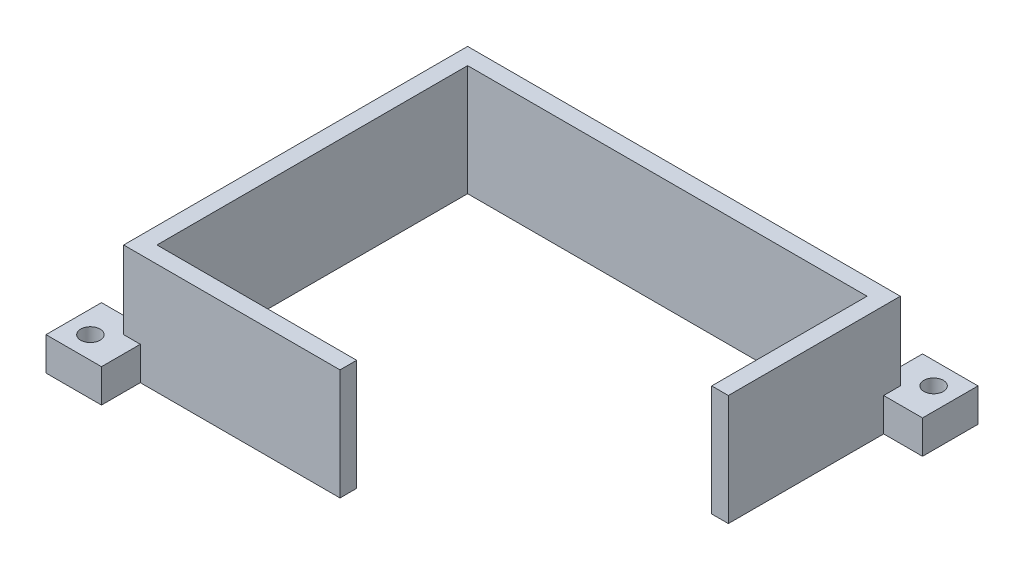
ISO-10303-21;
HEADER;
FILE_DESCRIPTION(('STEP AP214'),'2;1');
FILE_NAME('part.step','',(''),(''),'','','');
FILE_SCHEMA(('AUTOMOTIVE_DESIGN { 1 0 10303 214 1 1 1 1 }'));
ENDSEC;
DATA;
#1=APPLICATION_CONTEXT('core data for automotive mechanical design processes');
#2=APPLICATION_PROTOCOL_DEFINITION('international standard','automotive_design',2000,#1);
#3=PRODUCT_CONTEXT('',#1,'mechanical');
#4=PRODUCT('Part','Part','',(#3));
#5=PRODUCT_RELATED_PRODUCT_CATEGORY('part','',(#4));
#6=PRODUCT_DEFINITION_FORMATION('','',#4);
#7=PRODUCT_DEFINITION_CONTEXT('part definition',#1,'design');
#8=PRODUCT_DEFINITION('design','',#6,#7);
#9=PRODUCT_DEFINITION_SHAPE('','',#8);
#10=(LENGTH_UNIT() NAMED_UNIT(*) SI_UNIT(.MILLI.,.METRE.));
#11=(NAMED_UNIT(*) PLANE_ANGLE_UNIT() SI_UNIT($,.RADIAN.));
#12=(NAMED_UNIT(*) SI_UNIT($,.STERADIAN.) SOLID_ANGLE_UNIT());
#13=UNCERTAINTY_MEASURE_WITH_UNIT(LENGTH_MEASURE(1.E-05),#10,'distance_accuracy_value','');
#14=(GEOMETRIC_REPRESENTATION_CONTEXT(3) GLOBAL_UNCERTAINTY_ASSIGNED_CONTEXT((#13)) GLOBAL_UNIT_ASSIGNED_CONTEXT((#10,
#11,#12)) REPRESENTATION_CONTEXT('',''));
#15=CARTESIAN_POINT('',(0.,0.,0.));
#16=DIRECTION('',(0.,0.,1.));
#17=DIRECTION('',(1.,0.,0.));
#18=AXIS2_PLACEMENT_3D('',#15,#16,#17);
#19=CARTESIAN_POINT('',(-36.,20.,-28.));
#20=DIRECTION('',(-1.,0.,0.));
#21=DIRECTION('',(0.,0.,1.));
#22=AXIS2_PLACEMENT_3D('',#19,#20,#21);
#23=PLANE('',#22);
#24=DIRECTION('',(0.,0.,-1.));
#25=VECTOR('',#24,1.);
#26=CARTESIAN_POINT('',(-36.,0.,-28.));
#27=LINE('',#26,#25);
#28=CARTESIAN_POINT('',(-36.,0.,28.));
#29=VERTEX_POINT('',#28);
#30=CARTESIAN_POINT('',(-36.,0.,-28.));
#31=VERTEX_POINT('',#30);
#32=EDGE_CURVE('E334',#29,#31,#27,.T.);
#33=ORIENTED_EDGE('',*,*,#32,.T.);
#34=DIRECTION('',(0.,-1.,0.));
#35=VECTOR('',#34,1.);
#36=CARTESIAN_POINT('',(-36.,20.,-28.));
#37=LINE('',#36,#35);
#38=CARTESIAN_POINT('',(-36.,20.,-28.));
#39=VERTEX_POINT('',#38);
#40=EDGE_CURVE('E402',#39,#31,#37,.T.);
#41=ORIENTED_EDGE('',*,*,#40,.F.);
#42=DIRECTION('',(0.,0.,-1.));
#43=VECTOR('',#42,1.);
#44=CARTESIAN_POINT('',(-36.,20.,-28.));
#45=LINE('',#44,#43);
#46=CARTESIAN_POINT('',(-36.,20.,28.));
#47=VERTEX_POINT('',#46);
#48=EDGE_CURVE('E335',#47,#39,#45,.T.);
#49=ORIENTED_EDGE('',*,*,#48,.F.);
#50=DIRECTION('',(0.,-1.,0.));
#51=VECTOR('',#50,1.);
#52=CARTESIAN_POINT('',(-36.,20.,28.));
#53=LINE('',#52,#51);
#54=EDGE_CURVE('E357',#47,#29,#53,.T.);
#55=ORIENTED_EDGE('',*,*,#54,.T.);
#56=EDGE_LOOP('',(#33,#41,#49,#55));
#57=FACE_BOUND('',#56,.T.);
#58=ADVANCED_FACE('F35',(#57),#23,.F.);
#59=CARTESIAN_POINT('',(-36.,20.,-28.));
#60=DIRECTION('',(0.,0.,-1.));
#61=DIRECTION('',(-1.,0.,0.));
#62=AXIS2_PLACEMENT_3D('',#59,#60,#61);
#63=PLANE('',#62);
#64=DIRECTION('',(1.,0.,0.));
#65=VECTOR('',#64,1.);
#66=CARTESIAN_POINT('',(-36.,0.,-28.));
#67=LINE('',#66,#65);
#68=CARTESIAN_POINT('',(36.,0.,-28.));
#69=VERTEX_POINT('',#68);
#70=EDGE_CURVE('E360',#31,#69,#67,.T.);
#71=ORIENTED_EDGE('',*,*,#70,.T.);
#72=DIRECTION('',(0.,-1.,0.));
#73=VECTOR('',#72,1.);
#74=CARTESIAN_POINT('',(36.,20.,-28.));
#75=LINE('',#74,#73);
#76=CARTESIAN_POINT('',(36.,20.,-28.));
#77=VERTEX_POINT('',#76);
#78=EDGE_CURVE('E400',#77,#69,#75,.T.);
#79=ORIENTED_EDGE('',*,*,#78,.F.);
#80=DIRECTION('',(1.,0.,0.));
#81=VECTOR('',#80,1.);
#82=CARTESIAN_POINT('',(-36.,20.,-28.));
#83=LINE('',#82,#81);
#84=EDGE_CURVE('E338',#39,#77,#83,.T.);
#85=ORIENTED_EDGE('',*,*,#84,.F.);
#86=ORIENTED_EDGE('',*,*,#40,.T.);
#87=EDGE_LOOP('',(#71,#79,#85,#86));
#88=FACE_BOUND('',#87,.T.);
#89=ADVANCED_FACE('F472',(#88),#63,.F.);
#90=CARTESIAN_POINT('',(36.,20.,-28.));
#91=DIRECTION('',(1.,0.,0.));
#92=DIRECTION('',(0.,0.,-1.));
#93=AXIS2_PLACEMENT_3D('',#90,#91,#92);
#94=PLANE('',#93);
#95=DIRECTION('',(0.,0.,1.));
#96=VECTOR('',#95,1.);
#97=CARTESIAN_POINT('',(36.,0.,-28.));
#98=LINE('',#97,#96);
#99=CARTESIAN_POINT('',(36.,0.,0.));
#100=VERTEX_POINT('',#99);
#101=EDGE_CURVE('E363',#69,#100,#98,.T.);
#102=ORIENTED_EDGE('',*,*,#101,.T.);
#103=DIRECTION('',(0.,-1.,0.));
#104=VECTOR('',#103,1.);
#105=CARTESIAN_POINT('',(36.,20.,0.));
#106=LINE('',#105,#104);
#107=CARTESIAN_POINT('',(36.,20.,0.));
#108=VERTEX_POINT('',#107);
#109=EDGE_CURVE('E397',#108,#100,#106,.T.);
#110=ORIENTED_EDGE('',*,*,#109,.F.);
#111=DIRECTION('',(0.,0.,1.));
#112=VECTOR('',#111,1.);
#113=CARTESIAN_POINT('',(36.,20.,-28.));
#114=LINE('',#113,#112);
#115=EDGE_CURVE('E341',#77,#108,#114,.T.);
#116=ORIENTED_EDGE('',*,*,#115,.F.);
#117=ORIENTED_EDGE('',*,*,#78,.T.);
#118=EDGE_LOOP('',(#102,#110,#116,#117));
#119=FACE_BOUND('',#118,.T.);
#120=ADVANCED_FACE('F478',(#119),#94,.F.);
#121=CARTESIAN_POINT('',(39.,20.,0.));
#122=DIRECTION('',(0.,0.,-1.));
#123=DIRECTION('',(-1.,0.,0.));
#124=AXIS2_PLACEMENT_3D('',#121,#122,#123);
#125=PLANE('',#124);
#126=DIRECTION('',(1.,0.,0.));
#127=VECTOR('',#126,1.);
#128=CARTESIAN_POINT('',(39.,0.,0.));
#129=LINE('',#128,#127);
#130=CARTESIAN_POINT('',(39.,0.,0.));
#131=VERTEX_POINT('',#130);
#132=EDGE_CURVE('E365',#100,#131,#129,.T.);
#133=ORIENTED_EDGE('',*,*,#132,.T.);
#134=DIRECTION('',(0.,-1.,0.));
#135=VECTOR('',#134,1.);
#136=CARTESIAN_POINT('',(39.,20.,0.));
#137=LINE('',#136,#135);
#138=CARTESIAN_POINT('',(39.,20.,0.));
#139=VERTEX_POINT('',#138);
#140=EDGE_CURVE('E394',#139,#131,#137,.T.);
#141=ORIENTED_EDGE('',*,*,#140,.F.);
#142=DIRECTION('',(1.,0.,0.));
#143=VECTOR('',#142,1.);
#144=CARTESIAN_POINT('',(39.,20.,0.));
#145=LINE('',#144,#143);
#146=EDGE_CURVE('E343',#108,#139,#145,.T.);
#147=ORIENTED_EDGE('',*,*,#146,.F.);
#148=ORIENTED_EDGE('',*,*,#109,.T.);
#149=EDGE_LOOP('',(#133,#141,#147,#148));
#150=FACE_BOUND('',#149,.T.);
#151=ADVANCED_FACE('F535',(#150),#125,.F.);
#152=CARTESIAN_POINT('',(39.,20.,-31.));
#153=DIRECTION('',(-1.,0.,0.));
#154=DIRECTION('',(0.,0.,1.));
#155=AXIS2_PLACEMENT_3D('',#152,#153,#154);
#156=PLANE('',#155);
#157=DIRECTION('',(0.,0.,-1.));
#158=VECTOR('',#157,1.);
#159=CARTESIAN_POINT('',(39.,0.,-31.));
#160=LINE('',#159,#158);
#161=CARTESIAN_POINT('',(39.,0.,-28.));
#162=VERTEX_POINT('',#161);
#163=EDGE_CURVE('E367',#131,#162,#160,.T.);
#164=ORIENTED_EDGE('',*,*,#163,.T.);
#165=DIRECTION('',(0.,1.,0.));
#166=VECTOR('',#165,1.);
#167=CARTESIAN_POINT('',(39.,20.,-28.));
#168=LINE('',#167,#166);
#169=CARTESIAN_POINT('',(39.,6.,-28.));
#170=VERTEX_POINT('',#169);
#171=EDGE_CURVE('E49',#162,#170,#168,.T.);
#172=ORIENTED_EDGE('',*,*,#171,.T.);
#173=DIRECTION('',(0.,0.,1.));
#174=VECTOR('',#173,1.);
#175=CARTESIAN_POINT('',(39.,6.,-31.));
#176=LINE('',#175,#174);
#177=CARTESIAN_POINT('',(39.,6.,-31.));
#178=VERTEX_POINT('',#177);
#179=EDGE_CURVE('E246',#178,#170,#176,.T.);
#180=ORIENTED_EDGE('',*,*,#179,.F.);
#181=DIRECTION('',(0.,-1.,0.));
#182=VECTOR('',#181,1.);
#183=CARTESIAN_POINT('',(39.,20.,-31.));
#184=LINE('',#183,#182);
#185=CARTESIAN_POINT('',(39.,20.,-31.));
#186=VERTEX_POINT('',#185);
#187=EDGE_CURVE('E392',#186,#178,#184,.T.);
#188=ORIENTED_EDGE('',*,*,#187,.F.);
#189=DIRECTION('',(0.,0.,-1.));
#190=VECTOR('',#189,1.);
#191=CARTESIAN_POINT('',(39.,20.,-31.));
#192=LINE('',#191,#190);
#193=EDGE_CURVE('E345',#139,#186,#192,.T.);
#194=ORIENTED_EDGE('',*,*,#193,.F.);
#195=ORIENTED_EDGE('',*,*,#140,.T.);
#196=EDGE_LOOP('',(#164,#172,#180,#188,#194,#195));
#197=FACE_BOUND('',#196,.T.);
#198=ADVANCED_FACE('F532',(#197),#156,.F.);
#199=CARTESIAN_POINT('',(-39.,20.,-31.));
#200=DIRECTION('',(0.,0.,1.));
#201=DIRECTION('',(1.,0.,0.));
#202=AXIS2_PLACEMENT_3D('',#199,#200,#201);
#203=PLANE('',#202);
#204=DIRECTION('',(1.,0.,0.));
#205=VECTOR('',#204,1.);
#206=CARTESIAN_POINT('',(-39.,6.,-31.));
#207=LINE('',#206,#205);
#208=CARTESIAN_POINT('',(36.,6.,-31.));
#209=VERTEX_POINT('',#208);
#210=EDGE_CURVE('E11',#209,#178,#207,.T.);
#211=ORIENTED_EDGE('',*,*,#210,.F.);
#212=DIRECTION('',(0.,-1.,0.));
#213=VECTOR('',#212,1.);
#214=CARTESIAN_POINT('',(36.,20.,-31.));
#215=LINE('',#214,#213);
#216=CARTESIAN_POINT('',(36.,0.,-31.));
#217=VERTEX_POINT('',#216);
#218=EDGE_CURVE('E207',#209,#217,#215,.T.);
#219=ORIENTED_EDGE('',*,*,#218,.T.);
#220=DIRECTION('',(-1.,0.,0.));
#221=VECTOR('',#220,1.);
#222=CARTESIAN_POINT('',(-39.,0.,-31.));
#223=LINE('',#222,#221);
#224=CARTESIAN_POINT('',(-36.,0.,-31.));
#225=VERTEX_POINT('',#224);
#226=EDGE_CURVE('E369',#217,#225,#223,.T.);
#227=ORIENTED_EDGE('',*,*,#226,.T.);
#228=DIRECTION('',(0.,1.,0.));
#229=VECTOR('',#228,1.);
#230=CARTESIAN_POINT('',(-36.,20.,-31.));
#231=LINE('',#230,#229);
#232=CARTESIAN_POINT('',(-36.,6.,-31.));
#233=VERTEX_POINT('',#232);
#234=EDGE_CURVE('E279',#225,#233,#231,.T.);
#235=ORIENTED_EDGE('',*,*,#234,.T.);
#236=DIRECTION('',(1.,0.,0.));
#237=VECTOR('',#236,1.);
#238=CARTESIAN_POINT('',(-39.,6.,-31.));
#239=LINE('',#238,#237);
#240=CARTESIAN_POINT('',(-39.,6.,-31.));
#241=VERTEX_POINT('',#240);
#242=EDGE_CURVE('E288',#241,#233,#239,.T.);
#243=ORIENTED_EDGE('',*,*,#242,.F.);
#244=DIRECTION('',(0.,-1.,0.));
#245=VECTOR('',#244,1.);
#246=CARTESIAN_POINT('',(-39.,20.,-31.));
#247=LINE('',#246,#245);
#248=CARTESIAN_POINT('',(-39.,20.,-31.));
#249=VERTEX_POINT('',#248);
#250=EDGE_CURVE('E389',#249,#241,#247,.T.);
#251=ORIENTED_EDGE('',*,*,#250,.F.);
#252=DIRECTION('',(-1.,0.,0.));
#253=VECTOR('',#252,1.);
#254=CARTESIAN_POINT('',(-39.,20.,-31.));
#255=LINE('',#254,#253);
#256=EDGE_CURVE('E347',#186,#249,#255,.T.);
#257=ORIENTED_EDGE('',*,*,#256,.F.);
#258=ORIENTED_EDGE('',*,*,#187,.T.);
#259=EDGE_LOOP('',(#211,#219,#227,#235,#243,#251,#257,#258));
#260=FACE_BOUND('',#259,.T.);
#261=ADVANCED_FACE('F449',(#260),#203,.F.);
#262=CARTESIAN_POINT('',(-39.,20.,31.));
#263=DIRECTION('',(1.,0.,0.));
#264=DIRECTION('',(0.,0.,-1.));
#265=AXIS2_PLACEMENT_3D('',#262,#263,#264);
#266=PLANE('',#265);
#267=DIRECTION('',(0.,0.,-1.));
#268=VECTOR('',#267,1.);
#269=CARTESIAN_POINT('',(-39.,6.,31.));
#270=LINE('',#269,#268);
#271=CARTESIAN_POINT('',(-39.,6.,-28.));
#272=VERTEX_POINT('',#271);
#273=EDGE_CURVE('E42',#272,#241,#270,.T.);
#274=ORIENTED_EDGE('',*,*,#273,.F.);
#275=DIRECTION('',(0.,-1.,0.));
#276=VECTOR('',#275,1.);
#277=CARTESIAN_POINT('',(-39.,20.,-28.));
#278=LINE('',#277,#276);
#279=CARTESIAN_POINT('',(-39.,0.,-28.));
#280=VERTEX_POINT('',#279);
#281=EDGE_CURVE('E285',#272,#280,#278,.T.);
#282=ORIENTED_EDGE('',*,*,#281,.T.);
#283=DIRECTION('',(0.,0.,1.));
#284=VECTOR('',#283,1.);
#285=CARTESIAN_POINT('',(-39.,0.,31.));
#286=LINE('',#285,#284);
#287=CARTESIAN_POINT('',(-39.,0.,28.));
#288=VERTEX_POINT('',#287);
#289=EDGE_CURVE('E371',#280,#288,#286,.T.);
#290=ORIENTED_EDGE('',*,*,#289,.T.);
#291=DIRECTION('',(0.,1.,0.));
#292=VECTOR('',#291,1.);
#293=CARTESIAN_POINT('',(-39.,20.,28.));
#294=LINE('',#293,#292);
#295=CARTESIAN_POINT('',(-39.,6.,28.));
#296=VERTEX_POINT('',#295);
#297=EDGE_CURVE('E322',#288,#296,#294,.T.);
#298=ORIENTED_EDGE('',*,*,#297,.T.);
#299=DIRECTION('',(0.,0.,-1.));
#300=VECTOR('',#299,1.);
#301=CARTESIAN_POINT('',(-39.,6.,31.));
#302=LINE('',#301,#300);
#303=CARTESIAN_POINT('',(-39.,6.,31.));
#304=VERTEX_POINT('',#303);
#305=EDGE_CURVE('E331',#304,#296,#302,.T.);
#306=ORIENTED_EDGE('',*,*,#305,.F.);
#307=DIRECTION('',(0.,-1.,0.));
#308=VECTOR('',#307,1.);
#309=CARTESIAN_POINT('',(-39.,20.,31.));
#310=LINE('',#309,#308);
#311=CARTESIAN_POINT('',(-39.,20.,31.));
#312=VERTEX_POINT('',#311);
#313=EDGE_CURVE('E386',#312,#304,#310,.T.);
#314=ORIENTED_EDGE('',*,*,#313,.F.);
#315=DIRECTION('',(0.,0.,1.));
#316=VECTOR('',#315,1.);
#317=CARTESIAN_POINT('',(-39.,20.,31.));
#318=LINE('',#317,#316);
#319=EDGE_CURVE('E349',#249,#312,#318,.T.);
#320=ORIENTED_EDGE('',*,*,#319,.F.);
#321=ORIENTED_EDGE('',*,*,#250,.T.);
#322=EDGE_LOOP('',(#274,#282,#290,#298,#306,#314,#320,#321));
#323=FACE_BOUND('',#322,.T.);
#324=ADVANCED_FACE('F414',(#323),#266,.F.);
#325=CARTESIAN_POINT('',(0.,20.,31.));
#326=DIRECTION('',(0.,0.,-1.));
#327=DIRECTION('',(-1.,0.,0.));
#328=AXIS2_PLACEMENT_3D('',#325,#326,#327);
#329=PLANE('',#328);
#330=DIRECTION('',(-1.,0.,0.));
#331=VECTOR('',#330,1.);
#332=CARTESIAN_POINT('',(0.,6.,31.));
#333=LINE('',#332,#331);
#334=CARTESIAN_POINT('',(-36.,6.,31.));
#335=VERTEX_POINT('',#334);
#336=EDGE_CURVE('E404',#335,#304,#333,.T.);
#337=ORIENTED_EDGE('',*,*,#336,.F.);
#338=DIRECTION('',(0.,-1.,0.));
#339=VECTOR('',#338,1.);
#340=CARTESIAN_POINT('',(-36.,20.,31.));
#341=LINE('',#340,#339);
#342=CARTESIAN_POINT('',(-36.,0.,31.));
#343=VERTEX_POINT('',#342);
#344=EDGE_CURVE('E328',#335,#343,#341,.T.);
#345=ORIENTED_EDGE('',*,*,#344,.T.);
#346=DIRECTION('',(1.,0.,0.));
#347=VECTOR('',#346,1.);
#348=CARTESIAN_POINT('',(0.,0.,31.));
#349=LINE('',#348,#347);
#350=CARTESIAN_POINT('',(0.,0.,31.));
#351=VERTEX_POINT('',#350);
#352=EDGE_CURVE('E373',#343,#351,#349,.T.);
#353=ORIENTED_EDGE('',*,*,#352,.T.);
#354=DIRECTION('',(0.,-1.,0.));
#355=VECTOR('',#354,1.);
#356=CARTESIAN_POINT('',(0.,20.,31.));
#357=LINE('',#356,#355);
#358=CARTESIAN_POINT('',(0.,20.,31.));
#359=VERTEX_POINT('',#358);
#360=EDGE_CURVE('E383',#359,#351,#357,.T.);
#361=ORIENTED_EDGE('',*,*,#360,.F.);
#362=DIRECTION('',(1.,0.,0.));
#363=VECTOR('',#362,1.);
#364=CARTESIAN_POINT('',(0.,20.,31.));
#365=LINE('',#364,#363);
#366=EDGE_CURVE('E351',#312,#359,#365,.T.);
#367=ORIENTED_EDGE('',*,*,#366,.F.);
#368=ORIENTED_EDGE('',*,*,#313,.T.);
#369=EDGE_LOOP('',(#337,#345,#353,#361,#367,#368));
#370=FACE_BOUND('',#369,.T.);
#371=ADVANCED_FACE('F439',(#370),#329,.F.);
#372=CARTESIAN_POINT('',(0.,20.,28.));
#373=DIRECTION('',(-1.,0.,0.));
#374=DIRECTION('',(0.,0.,1.));
#375=AXIS2_PLACEMENT_3D('',#372,#373,#374);
#376=PLANE('',#375);
#377=DIRECTION('',(0.,0.,-1.));
#378=VECTOR('',#377,1.);
#379=CARTESIAN_POINT('',(0.,0.,28.));
#380=LINE('',#379,#378);
#381=CARTESIAN_POINT('',(0.,0.,28.));
#382=VERTEX_POINT('',#381);
#383=EDGE_CURVE('E375',#351,#382,#380,.T.);
#384=ORIENTED_EDGE('',*,*,#383,.T.);
#385=DIRECTION('',(0.,-1.,0.));
#386=VECTOR('',#385,1.);
#387=CARTESIAN_POINT('',(0.,20.,28.));
#388=LINE('',#387,#386);
#389=CARTESIAN_POINT('',(0.,20.,28.));
#390=VERTEX_POINT('',#389);
#391=EDGE_CURVE('E380',#390,#382,#388,.T.);
#392=ORIENTED_EDGE('',*,*,#391,.F.);
#393=DIRECTION('',(0.,0.,-1.));
#394=VECTOR('',#393,1.);
#395=CARTESIAN_POINT('',(0.,20.,28.));
#396=LINE('',#395,#394);
#397=EDGE_CURVE('E353',#359,#390,#396,.T.);
#398=ORIENTED_EDGE('',*,*,#397,.F.);
#399=ORIENTED_EDGE('',*,*,#360,.T.);
#400=EDGE_LOOP('',(#384,#392,#398,#399));
#401=FACE_BOUND('',#400,.T.);
#402=ADVANCED_FACE('F494',(#401),#376,.F.);
#403=CARTESIAN_POINT('',(-36.,20.,28.));
#404=DIRECTION('',(0.,0.,1.));
#405=DIRECTION('',(1.,0.,0.));
#406=AXIS2_PLACEMENT_3D('',#403,#404,#405);
#407=PLANE('',#406);
#408=DIRECTION('',(-1.,0.,0.));
#409=VECTOR('',#408,1.);
#410=CARTESIAN_POINT('',(-36.,0.,28.));
#411=LINE('',#410,#409);
#412=EDGE_CURVE('E339',#382,#29,#411,.T.);
#413=ORIENTED_EDGE('',*,*,#412,.T.);
#414=ORIENTED_EDGE('',*,*,#54,.F.);
#415=DIRECTION('',(-1.,0.,0.));
#416=VECTOR('',#415,1.);
#417=CARTESIAN_POINT('',(-36.,20.,28.));
#418=LINE('',#417,#416);
#419=EDGE_CURVE('E355',#390,#47,#418,.T.);
#420=ORIENTED_EDGE('',*,*,#419,.F.);
#421=ORIENTED_EDGE('',*,*,#391,.T.);
#422=EDGE_LOOP('',(#413,#414,#420,#421));
#423=FACE_BOUND('',#422,.T.);
#424=ADVANCED_FACE('F492',(#423),#407,.F.);
#425=CARTESIAN_POINT('',(0.,20.,0.));
#426=DIRECTION('',(0.,1.,0.));
#427=DIRECTION('',(0.,0.,1.));
#428=AXIS2_PLACEMENT_3D('',#425,#426,#427);
#429=PLANE('',#428);
#430=ORIENTED_EDGE('',*,*,#48,.T.);
#431=ORIENTED_EDGE('',*,*,#84,.T.);
#432=ORIENTED_EDGE('',*,*,#115,.T.);
#433=ORIENTED_EDGE('',*,*,#146,.T.);
#434=ORIENTED_EDGE('',*,*,#193,.T.);
#435=ORIENTED_EDGE('',*,*,#256,.T.);
#436=ORIENTED_EDGE('',*,*,#319,.T.);
#437=ORIENTED_EDGE('',*,*,#366,.T.);
#438=ORIENTED_EDGE('',*,*,#397,.T.);
#439=ORIENTED_EDGE('',*,*,#419,.T.);
#440=EDGE_LOOP('',(#430,#431,#432,#433,#434,#435,#436,#437,#438,#439));
#441=FACE_BOUND('',#440,.T.);
#442=ADVANCED_FACE('F444',(#441),#429,.T.);
#443=CARTESIAN_POINT('',(0.,0.,0.));
#444=DIRECTION('',(0.,1.,0.));
#445=DIRECTION('',(0.,0.,1.));
#446=AXIS2_PLACEMENT_3D('',#443,#444,#445);
#447=PLANE('',#446);
#448=ORIENTED_EDGE('',*,*,#101,.F.);
#449=ORIENTED_EDGE('',*,*,#70,.F.);
#450=ORIENTED_EDGE('',*,*,#32,.F.);
#451=ORIENTED_EDGE('',*,*,#412,.F.);
#452=ORIENTED_EDGE('',*,*,#383,.F.);
#453=ORIENTED_EDGE('',*,*,#352,.F.);
#454=DIRECTION('',(0.,0.,1.));
#455=VECTOR('',#454,1.);
#456=CARTESIAN_POINT('',(-36.,0.,28.));
#457=LINE('',#456,#455);
#458=CARTESIAN_POINT('',(-36.,0.,38.));
#459=VERTEX_POINT('',#458);
#460=EDGE_CURVE('E295',#343,#459,#457,.T.);
#461=ORIENTED_EDGE('',*,*,#460,.T.);
#462=DIRECTION('',(-1.,0.,0.));
#463=VECTOR('',#462,1.);
#464=CARTESIAN_POINT('',(-36.,0.,38.));
#465=LINE('',#464,#463);
#466=CARTESIAN_POINT('',(-46.,0.,38.));
#467=VERTEX_POINT('',#466);
#468=EDGE_CURVE('E312',#459,#467,#465,.T.);
#469=ORIENTED_EDGE('',*,*,#468,.T.);
#470=DIRECTION('',(0.,0.,-1.));
#471=VECTOR('',#470,1.);
#472=CARTESIAN_POINT('',(-46.,0.,28.));
#473=LINE('',#472,#471);
#474=CARTESIAN_POINT('',(-46.,0.,28.));
#475=VERTEX_POINT('',#474);
#476=EDGE_CURVE('E315',#467,#475,#473,.T.);
#477=ORIENTED_EDGE('',*,*,#476,.T.);
#478=DIRECTION('',(1.,0.,0.));
#479=VECTOR('',#478,1.);
#480=CARTESIAN_POINT('',(-36.,0.,28.));
#481=LINE('',#480,#479);
#482=EDGE_CURVE('E301',#475,#288,#481,.T.);
#483=ORIENTED_EDGE('',*,*,#482,.T.);
#484=ORIENTED_EDGE('',*,*,#289,.F.);
#485=DIRECTION('',(-1.,0.,0.));
#486=VECTOR('',#485,1.);
#487=CARTESIAN_POINT('',(-36.,0.,-28.));
#488=LINE('',#487,#486);
#489=CARTESIAN_POINT('',(-46.,0.,-28.));
#490=VERTEX_POINT('',#489);
#491=EDGE_CURVE('E252',#280,#490,#488,.T.);
#492=ORIENTED_EDGE('',*,*,#491,.T.);
#493=DIRECTION('',(0.,0.,-1.));
#494=VECTOR('',#493,1.);
#495=CARTESIAN_POINT('',(-46.,0.,-28.));
#496=LINE('',#495,#494);
#497=CARTESIAN_POINT('',(-46.,0.,-38.));
#498=VERTEX_POINT('',#497);
#499=EDGE_CURVE('E269',#490,#498,#496,.T.);
#500=ORIENTED_EDGE('',*,*,#499,.T.);
#501=DIRECTION('',(1.,0.,0.));
#502=VECTOR('',#501,1.);
#503=CARTESIAN_POINT('',(-36.,0.,-38.));
#504=LINE('',#503,#502);
#505=CARTESIAN_POINT('',(-36.,0.,-38.));
#506=VERTEX_POINT('',#505);
#507=EDGE_CURVE('E272',#498,#506,#504,.T.);
#508=ORIENTED_EDGE('',*,*,#507,.T.);
#509=DIRECTION('',(0.,0.,1.));
#510=VECTOR('',#509,1.);
#511=CARTESIAN_POINT('',(-36.,0.,-28.));
#512=LINE('',#511,#510);
#513=EDGE_CURVE('E258',#506,#225,#512,.T.);
#514=ORIENTED_EDGE('',*,*,#513,.T.);
#515=ORIENTED_EDGE('',*,*,#226,.F.);
#516=DIRECTION('',(0.,0.,-1.));
#517=VECTOR('',#516,1.);
#518=CARTESIAN_POINT('',(36.,0.,-28.));
#519=LINE('',#518,#517);
#520=CARTESIAN_POINT('',(36.,0.,-38.));
#521=VERTEX_POINT('',#520);
#522=EDGE_CURVE('E232',#217,#521,#519,.T.);
#523=ORIENTED_EDGE('',*,*,#522,.T.);
#524=DIRECTION('',(1.,0.,0.));
#525=VECTOR('',#524,1.);
#526=CARTESIAN_POINT('',(36.,0.,-38.));
#527=LINE('',#526,#525);
#528=CARTESIAN_POINT('',(46.,0.,-38.));
#529=VERTEX_POINT('',#528);
#530=EDGE_CURVE('E217',#521,#529,#527,.T.);
#531=ORIENTED_EDGE('',*,*,#530,.T.);
#532=DIRECTION('',(0.,0.,1.));
#533=VECTOR('',#532,1.);
#534=CARTESIAN_POINT('',(46.,0.,-28.));
#535=LINE('',#534,#533);
#536=CARTESIAN_POINT('',(46.,0.,-28.));
#537=VERTEX_POINT('',#536);
#538=EDGE_CURVE('E236',#529,#537,#535,.T.);
#539=ORIENTED_EDGE('',*,*,#538,.T.);
#540=DIRECTION('',(-1.,0.,0.));
#541=VECTOR('',#540,1.);
#542=CARTESIAN_POINT('',(36.,0.,-28.));
#543=LINE('',#542,#541);
#544=EDGE_CURVE('E211',#537,#162,#543,.T.);
#545=ORIENTED_EDGE('',*,*,#544,.T.);
#546=ORIENTED_EDGE('',*,*,#163,.F.);
#547=ORIENTED_EDGE('',*,*,#132,.F.);
#548=EDGE_LOOP('',(#448,#449,#450,#451,#452,#453,#461,#469,#477,#483,#484,#492,#500,#508,#514,
#515,#523,#531,#539,#545,#546,#547));
#549=FACE_BOUND('',#548,.T.);
#550=CARTESIAN_POINT('',(-42.,0.,-34.));
#551=DIRECTION('',(0.,-1.,0.));
#552=DIRECTION('',(0.,0.,1.));
#553=AXIS2_PLACEMENT_3D('',#550,#551,#552);
#554=CIRCLE('',#553,1.75);
#555=CARTESIAN_POINT('',(-42.,0.,-32.25));
#556=VERTEX_POINT('',#555);
#557=EDGE_CURVE('E248',#556,#556,#554,.T.);
#558=ORIENTED_EDGE('',*,*,#557,.F.);
#559=EDGE_LOOP('',(#558));
#560=FACE_BOUND('',#559,.T.);
#561=CARTESIAN_POINT('',(-42.,0.,34.));
#562=DIRECTION('',(0.,-1.,0.));
#563=DIRECTION('',(0.,0.,-1.));
#564=AXIS2_PLACEMENT_3D('',#561,#562,#563);
#565=CIRCLE('',#564,1.75);
#566=CARTESIAN_POINT('',(-42.,0.,32.25));
#567=VERTEX_POINT('',#566);
#568=EDGE_CURVE('E291',#567,#567,#565,.T.);
#569=ORIENTED_EDGE('',*,*,#568,.F.);
#570=EDGE_LOOP('',(#569));
#571=FACE_BOUND('',#570,.T.);
#572=CARTESIAN_POINT('',(42.,0.,-34.));
#573=DIRECTION('',(0.,-1.,0.));
#574=DIRECTION('',(0.,0.,-1.));
#575=AXIS2_PLACEMENT_3D('',#572,#573,#574);
#576=CIRCLE('',#575,1.75);
#577=CARTESIAN_POINT('',(42.,0.,-35.75));
#578=VERTEX_POINT('',#577);
#579=EDGE_CURVE('E589',#578,#578,#576,.T.);
#580=ORIENTED_EDGE('',*,*,#579,.F.);
#581=EDGE_LOOP('',(#580));
#582=FACE_BOUND('',#581,.T.);
#583=ADVANCED_FACE('F424',(#549,#560,#571,#582),#447,.F.);
#584=CARTESIAN_POINT('',(0.,6.,0.));
#585=DIRECTION('',(0.,-1.,0.));
#586=DIRECTION('',(0.,0.,-1.));
#587=AXIS2_PLACEMENT_3D('',#584,#585,#586);
#588=PLANE('',#587);
#589=CARTESIAN_POINT('',(-42.,6.,34.));
#590=DIRECTION('',(0.,-1.,0.));
#591=DIRECTION('',(0.,0.,-1.));
#592=AXIS2_PLACEMENT_3D('',#589,#590,#591);
#593=CIRCLE('',#592,1.75);
#594=CARTESIAN_POINT('',(-42.,6.,32.25));
#595=VERTEX_POINT('',#594);
#596=EDGE_CURVE('E292',#595,#595,#593,.T.);
#597=ORIENTED_EDGE('',*,*,#596,.T.);
#598=EDGE_LOOP('',(#597));
#599=FACE_BOUND('',#598,.T.);
#600=ORIENTED_EDGE('',*,*,#336,.T.);
#601=ORIENTED_EDGE('',*,*,#305,.T.);
#602=DIRECTION('',(1.,0.,0.));
#603=VECTOR('',#602,1.);
#604=CARTESIAN_POINT('',(-36.,6.,28.));
#605=LINE('',#604,#603);
#606=CARTESIAN_POINT('',(-46.,6.,28.));
#607=VERTEX_POINT('',#606);
#608=EDGE_CURVE('E307',#607,#296,#605,.T.);
#609=ORIENTED_EDGE('',*,*,#608,.F.);
#610=DIRECTION('',(0.,0.,-1.));
#611=VECTOR('',#610,1.);
#612=CARTESIAN_POINT('',(-46.,6.,28.));
#613=LINE('',#612,#611);
#614=CARTESIAN_POINT('',(-46.,6.,38.));
#615=VERTEX_POINT('',#614);
#616=EDGE_CURVE('E304',#615,#607,#613,.T.);
#617=ORIENTED_EDGE('',*,*,#616,.F.);
#618=DIRECTION('',(-1.,0.,0.));
#619=VECTOR('',#618,1.);
#620=CARTESIAN_POINT('',(-36.,6.,38.));
#621=LINE('',#620,#619);
#622=CARTESIAN_POINT('',(-36.,6.,38.));
#623=VERTEX_POINT('',#622);
#624=EDGE_CURVE('E300',#623,#615,#621,.T.);
#625=ORIENTED_EDGE('',*,*,#624,.F.);
#626=DIRECTION('',(0.,0.,1.));
#627=VECTOR('',#626,1.);
#628=CARTESIAN_POINT('',(-36.,6.,28.));
#629=LINE('',#628,#627);
#630=EDGE_CURVE('E298',#335,#623,#629,.T.);
#631=ORIENTED_EDGE('',*,*,#630,.F.);
#632=EDGE_LOOP('',(#600,#601,#609,#617,#625,#631));
#633=FACE_BOUND('',#632,.T.);
#634=ADVANCED_FACE('F433',(#599,#633),#588,.F.);
#635=CARTESIAN_POINT('',(-36.,6.,28.));
#636=DIRECTION('',(1.,0.,0.));
#637=DIRECTION('',(0.,0.,-1.));
#638=AXIS2_PLACEMENT_3D('',#635,#636,#637);
#639=PLANE('',#638);
#640=ORIENTED_EDGE('',*,*,#344,.F.);
#641=ORIENTED_EDGE('',*,*,#630,.T.);
#642=DIRECTION('',(0.,-1.,0.));
#643=VECTOR('',#642,1.);
#644=CARTESIAN_POINT('',(-36.,6.,38.));
#645=LINE('',#644,#643);
#646=EDGE_CURVE('E310',#623,#459,#645,.T.);
#647=ORIENTED_EDGE('',*,*,#646,.T.);
#648=ORIENTED_EDGE('',*,*,#460,.F.);
#649=EDGE_LOOP('',(#640,#641,#647,#648));
#650=FACE_BOUND('',#649,.T.);
#651=ADVANCED_FACE('F497',(#650),#639,.T.);
#652=CARTESIAN_POINT('',(-36.,6.,28.));
#653=DIRECTION('',(0.,0.,-1.));
#654=DIRECTION('',(-1.,0.,0.));
#655=AXIS2_PLACEMENT_3D('',#652,#653,#654);
#656=PLANE('',#655);
#657=ORIENTED_EDGE('',*,*,#297,.F.);
#658=ORIENTED_EDGE('',*,*,#482,.F.);
#659=DIRECTION('',(0.,-1.,0.));
#660=VECTOR('',#659,1.);
#661=CARTESIAN_POINT('',(-46.,6.,28.));
#662=LINE('',#661,#660);
#663=EDGE_CURVE('E320',#607,#475,#662,.T.);
#664=ORIENTED_EDGE('',*,*,#663,.F.);
#665=ORIENTED_EDGE('',*,*,#608,.T.);
#666=EDGE_LOOP('',(#657,#658,#664,#665));
#667=FACE_BOUND('',#666,.T.);
#668=ADVANCED_FACE('F429',(#667),#656,.T.);
#669=CARTESIAN_POINT('',(-46.,6.,28.));
#670=DIRECTION('',(-1.,0.,0.));
#671=DIRECTION('',(0.,0.,1.));
#672=AXIS2_PLACEMENT_3D('',#669,#670,#671);
#673=PLANE('',#672);
#674=ORIENTED_EDGE('',*,*,#476,.F.);
#675=DIRECTION('',(0.,-1.,0.));
#676=VECTOR('',#675,1.);
#677=CARTESIAN_POINT('',(-46.,6.,38.));
#678=LINE('',#677,#676);
#679=EDGE_CURVE('E323',#615,#467,#678,.T.);
#680=ORIENTED_EDGE('',*,*,#679,.F.);
#681=ORIENTED_EDGE('',*,*,#616,.T.);
#682=ORIENTED_EDGE('',*,*,#663,.T.);
#683=EDGE_LOOP('',(#674,#680,#681,#682));
#684=FACE_BOUND('',#683,.T.);
#685=ADVANCED_FACE('F504',(#684),#673,.T.);
#686=CARTESIAN_POINT('',(-36.,6.,38.));
#687=DIRECTION('',(0.,0.,1.));
#688=DIRECTION('',(1.,0.,0.));
#689=AXIS2_PLACEMENT_3D('',#686,#687,#688);
#690=PLANE('',#689);
#691=ORIENTED_EDGE('',*,*,#468,.F.);
#692=ORIENTED_EDGE('',*,*,#646,.F.);
#693=ORIENTED_EDGE('',*,*,#624,.T.);
#694=ORIENTED_EDGE('',*,*,#679,.T.);
#695=EDGE_LOOP('',(#691,#692,#693,#694));
#696=FACE_BOUND('',#695,.T.);
#697=ADVANCED_FACE('F501',(#696),#690,.T.);
#698=CARTESIAN_POINT('',(-42.,6.,34.));
#699=DIRECTION('',(0.,-1.,0.));
#700=DIRECTION('',(0.,0.,-1.));
#701=AXIS2_PLACEMENT_3D('',#698,#699,#700);
#702=CYLINDRICAL_SURFACE('',#701,1.75);
#703=ORIENTED_EDGE('',*,*,#596,.F.);
#704=EDGE_LOOP('',(#703));
#705=FACE_BOUND('',#704,.T.);
#706=ORIENTED_EDGE('',*,*,#568,.T.);
#707=EDGE_LOOP('',(#706));
#708=FACE_BOUND('',#707,.T.);
#709=ADVANCED_FACE('F511',(#705,#708),#702,.F.);
#710=CARTESIAN_POINT('',(0.,6.,0.));
#711=DIRECTION('',(0.,-1.,0.));
#712=DIRECTION('',(0.,0.,-1.));
#713=AXIS2_PLACEMENT_3D('',#710,#711,#712);
#714=PLANE('',#713);
#715=CARTESIAN_POINT('',(-42.,6.,-34.));
#716=DIRECTION('',(0.,-1.,0.));
#717=DIRECTION('',(0.,0.,1.));
#718=AXIS2_PLACEMENT_3D('',#715,#716,#717);
#719=CIRCLE('',#718,1.75);
#720=CARTESIAN_POINT('',(-42.,6.,-32.25));
#721=VERTEX_POINT('',#720);
#722=EDGE_CURVE('E249',#721,#721,#719,.T.);
#723=ORIENTED_EDGE('',*,*,#722,.T.);
#724=EDGE_LOOP('',(#723));
#725=FACE_BOUND('',#724,.T.);
#726=ORIENTED_EDGE('',*,*,#273,.T.);
#727=ORIENTED_EDGE('',*,*,#242,.T.);
#728=DIRECTION('',(0.,0.,1.));
#729=VECTOR('',#728,1.);
#730=CARTESIAN_POINT('',(-36.,6.,-28.));
#731=LINE('',#730,#729);
#732=CARTESIAN_POINT('',(-36.,6.,-38.));
#733=VERTEX_POINT('',#732);
#734=EDGE_CURVE('E264',#733,#233,#731,.T.);
#735=ORIENTED_EDGE('',*,*,#734,.F.);
#736=DIRECTION('',(1.,0.,0.));
#737=VECTOR('',#736,1.);
#738=CARTESIAN_POINT('',(-36.,6.,-38.));
#739=LINE('',#738,#737);
#740=CARTESIAN_POINT('',(-46.,6.,-38.));
#741=VERTEX_POINT('',#740);
#742=EDGE_CURVE('E261',#741,#733,#739,.T.);
#743=ORIENTED_EDGE('',*,*,#742,.F.);
#744=DIRECTION('',(0.,0.,-1.));
#745=VECTOR('',#744,1.);
#746=CARTESIAN_POINT('',(-46.,6.,-28.));
#747=LINE('',#746,#745);
#748=CARTESIAN_POINT('',(-46.,6.,-28.));
#749=VERTEX_POINT('',#748);
#750=EDGE_CURVE('E257',#749,#741,#747,.T.);
#751=ORIENTED_EDGE('',*,*,#750,.F.);
#752=DIRECTION('',(-1.,0.,0.));
#753=VECTOR('',#752,1.);
#754=CARTESIAN_POINT('',(-36.,6.,-28.));
#755=LINE('',#754,#753);
#756=EDGE_CURVE('E255',#272,#749,#755,.T.);
#757=ORIENTED_EDGE('',*,*,#756,.F.);
#758=EDGE_LOOP('',(#726,#727,#735,#743,#751,#757));
#759=FACE_BOUND('',#758,.T.);
#760=ADVANCED_FACE('F409',(#725,#759),#714,.F.);
#761=CARTESIAN_POINT('',(-36.,6.,-28.));
#762=DIRECTION('',(0.,0.,1.));
#763=DIRECTION('',(1.,0.,0.));
#764=AXIS2_PLACEMENT_3D('',#761,#762,#763);
#765=PLANE('',#764);
#766=ORIENTED_EDGE('',*,*,#281,.F.);
#767=ORIENTED_EDGE('',*,*,#756,.T.);
#768=DIRECTION('',(0.,-1.,0.));
#769=VECTOR('',#768,1.);
#770=CARTESIAN_POINT('',(-46.,6.,-28.));
#771=LINE('',#770,#769);
#772=EDGE_CURVE('E267',#749,#490,#771,.T.);
#773=ORIENTED_EDGE('',*,*,#772,.T.);
#774=ORIENTED_EDGE('',*,*,#491,.F.);
#775=EDGE_LOOP('',(#766,#767,#773,#774));
#776=FACE_BOUND('',#775,.T.);
#777=ADVANCED_FACE('F419',(#776),#765,.T.);
#778=CARTESIAN_POINT('',(-36.,6.,-28.));
#779=DIRECTION('',(1.,0.,0.));
#780=DIRECTION('',(0.,0.,-1.));
#781=AXIS2_PLACEMENT_3D('',#778,#779,#780);
#782=PLANE('',#781);
#783=ORIENTED_EDGE('',*,*,#234,.F.);
#784=ORIENTED_EDGE('',*,*,#513,.F.);
#785=DIRECTION('',(0.,-1.,0.));
#786=VECTOR('',#785,1.);
#787=CARTESIAN_POINT('',(-36.,6.,-38.));
#788=LINE('',#787,#786);
#789=EDGE_CURVE('E277',#733,#506,#788,.T.);
#790=ORIENTED_EDGE('',*,*,#789,.F.);
#791=ORIENTED_EDGE('',*,*,#734,.T.);
#792=EDGE_LOOP('',(#783,#784,#790,#791));
#793=FACE_BOUND('',#792,.T.);
#794=ADVANCED_FACE('F453',(#793),#782,.T.);
#795=CARTESIAN_POINT('',(-36.,6.,-38.));
#796=DIRECTION('',(0.,0.,-1.));
#797=DIRECTION('',(-1.,0.,0.));
#798=AXIS2_PLACEMENT_3D('',#795,#796,#797);
#799=PLANE('',#798);
#800=ORIENTED_EDGE('',*,*,#507,.F.);
#801=DIRECTION('',(0.,-1.,0.));
#802=VECTOR('',#801,1.);
#803=CARTESIAN_POINT('',(-46.,6.,-38.));
#804=LINE('',#803,#802);
#805=EDGE_CURVE('E280',#741,#498,#804,.T.);
#806=ORIENTED_EDGE('',*,*,#805,.F.);
#807=ORIENTED_EDGE('',*,*,#742,.T.);
#808=ORIENTED_EDGE('',*,*,#789,.T.);
#809=EDGE_LOOP('',(#800,#806,#807,#808));
#810=FACE_BOUND('',#809,.T.);
#811=ADVANCED_FACE('F456',(#810),#799,.T.);
#812=CARTESIAN_POINT('',(-46.,6.,-28.));
#813=DIRECTION('',(-1.,0.,0.));
#814=DIRECTION('',(0.,0.,1.));
#815=AXIS2_PLACEMENT_3D('',#812,#813,#814);
#816=PLANE('',#815);
#817=ORIENTED_EDGE('',*,*,#499,.F.);
#818=ORIENTED_EDGE('',*,*,#772,.F.);
#819=ORIENTED_EDGE('',*,*,#750,.T.);
#820=ORIENTED_EDGE('',*,*,#805,.T.);
#821=EDGE_LOOP('',(#817,#818,#819,#820));
#822=FACE_BOUND('',#821,.T.);
#823=ADVANCED_FACE('F459',(#822),#816,.T.);
#824=CARTESIAN_POINT('',(-42.,6.,-34.));
#825=DIRECTION('',(0.,-1.,0.));
#826=DIRECTION('',(0.,0.,-1.));
#827=AXIS2_PLACEMENT_3D('',#824,#825,#826);
#828=CYLINDRICAL_SURFACE('',#827,1.75);
#829=ORIENTED_EDGE('',*,*,#722,.F.);
#830=EDGE_LOOP('',(#829));
#831=FACE_BOUND('',#830,.T.);
#832=ORIENTED_EDGE('',*,*,#557,.T.);
#833=EDGE_LOOP('',(#832));
#834=FACE_BOUND('',#833,.T.);
#835=ADVANCED_FACE('F461',(#831,#834),#828,.F.);
#836=CARTESIAN_POINT('',(0.,6.,0.));
#837=DIRECTION('',(0.,-1.,0.));
#838=DIRECTION('',(0.,0.,-1.));
#839=AXIS2_PLACEMENT_3D('',#836,#837,#838);
#840=PLANE('',#839);
#841=CARTESIAN_POINT('',(42.,6.,-34.));
#842=DIRECTION('',(0.,-1.,0.));
#843=DIRECTION('',(0.,0.,-1.));
#844=AXIS2_PLACEMENT_3D('',#841,#842,#843);
#845=CIRCLE('',#844,1.75);
#846=CARTESIAN_POINT('',(42.,6.,-35.75));
#847=VERTEX_POINT('',#846);
#848=EDGE_CURVE('E234',#847,#847,#845,.T.);
#849=ORIENTED_EDGE('',*,*,#848,.T.);
#850=EDGE_LOOP('',(#849));
#851=FACE_BOUND('',#850,.T.);
#852=ORIENTED_EDGE('',*,*,#210,.T.);
#853=ORIENTED_EDGE('',*,*,#179,.T.);
#854=DIRECTION('',(-1.,0.,0.));
#855=VECTOR('',#854,1.);
#856=CARTESIAN_POINT('',(36.,6.,-28.));
#857=LINE('',#856,#855);
#858=CARTESIAN_POINT('',(46.,6.,-28.));
#859=VERTEX_POINT('',#858);
#860=EDGE_CURVE('E219',#859,#170,#857,.T.);
#861=ORIENTED_EDGE('',*,*,#860,.F.);
#862=DIRECTION('',(0.,0.,1.));
#863=VECTOR('',#862,1.);
#864=CARTESIAN_POINT('',(46.,6.,-28.));
#865=LINE('',#864,#863);
#866=CARTESIAN_POINT('',(46.,6.,-38.));
#867=VERTEX_POINT('',#866);
#868=EDGE_CURVE('E225',#867,#859,#865,.T.);
#869=ORIENTED_EDGE('',*,*,#868,.F.);
#870=DIRECTION('',(1.,0.,0.));
#871=VECTOR('',#870,1.);
#872=CARTESIAN_POINT('',(36.,6.,-38.));
#873=LINE('',#872,#871);
#874=CARTESIAN_POINT('',(36.,6.,-38.));
#875=VERTEX_POINT('',#874);
#876=EDGE_CURVE('E210',#875,#867,#873,.T.);
#877=ORIENTED_EDGE('',*,*,#876,.F.);
#878=DIRECTION('',(0.,0.,-1.));
#879=VECTOR('',#878,1.);
#880=CARTESIAN_POINT('',(36.,6.,-28.));
#881=LINE('',#880,#879);
#882=EDGE_CURVE('E201',#209,#875,#881,.T.);
#883=ORIENTED_EDGE('',*,*,#882,.F.);
#884=EDGE_LOOP('',(#852,#853,#861,#869,#877,#883));
#885=FACE_BOUND('',#884,.T.);
#886=ADVANCED_FACE('F222',(#851,#885),#840,.F.);
#887=CARTESIAN_POINT('',(36.,6.,-28.));
#888=DIRECTION('',(-1.,0.,0.));
#889=DIRECTION('',(0.,0.,1.));
#890=AXIS2_PLACEMENT_3D('',#887,#888,#889);
#891=PLANE('',#890);
#892=ORIENTED_EDGE('',*,*,#218,.F.);
#893=ORIENTED_EDGE('',*,*,#882,.T.);
#894=DIRECTION('',(0.,-1.,0.));
#895=VECTOR('',#894,1.);
#896=CARTESIAN_POINT('',(36.,6.,-38.));
#897=LINE('',#896,#895);
#898=EDGE_CURVE('E205',#875,#521,#897,.T.);
#899=ORIENTED_EDGE('',*,*,#898,.T.);
#900=ORIENTED_EDGE('',*,*,#522,.F.);
#901=EDGE_LOOP('',(#892,#893,#899,#900));
#902=FACE_BOUND('',#901,.T.);
#903=ADVANCED_FACE('F203',(#902),#891,.T.);
#904=CARTESIAN_POINT('',(36.,6.,-28.));
#905=DIRECTION('',(0.,0.,1.));
#906=DIRECTION('',(1.,0.,0.));
#907=AXIS2_PLACEMENT_3D('',#904,#905,#906);
#908=PLANE('',#907);
#909=ORIENTED_EDGE('',*,*,#171,.F.);
#910=ORIENTED_EDGE('',*,*,#544,.F.);
#911=DIRECTION('',(0.,-1.,0.));
#912=VECTOR('',#911,1.);
#913=CARTESIAN_POINT('',(46.,6.,-28.));
#914=LINE('',#913,#912);
#915=EDGE_CURVE('E241',#859,#537,#914,.T.);
#916=ORIENTED_EDGE('',*,*,#915,.F.);
#917=ORIENTED_EDGE('',*,*,#860,.T.);
#918=EDGE_LOOP('',(#909,#910,#916,#917));
#919=FACE_BOUND('',#918,.T.);
#920=ADVANCED_FACE('F549',(#919),#908,.T.);
#921=CARTESIAN_POINT('',(46.,6.,-28.));
#922=DIRECTION('',(1.,0.,0.));
#923=DIRECTION('',(0.,0.,-1.));
#924=AXIS2_PLACEMENT_3D('',#921,#922,#923);
#925=PLANE('',#924);
#926=ORIENTED_EDGE('',*,*,#538,.F.);
#927=DIRECTION('',(0.,-1.,0.));
#928=VECTOR('',#927,1.);
#929=CARTESIAN_POINT('',(46.,6.,-38.));
#930=LINE('',#929,#928);
#931=EDGE_CURVE('E218',#867,#529,#930,.T.);
#932=ORIENTED_EDGE('',*,*,#931,.F.);
#933=ORIENTED_EDGE('',*,*,#868,.T.);
#934=ORIENTED_EDGE('',*,*,#915,.T.);
#935=EDGE_LOOP('',(#926,#932,#933,#934));
#936=FACE_BOUND('',#935,.T.);
#937=ADVANCED_FACE('F552',(#936),#925,.T.);
#938=CARTESIAN_POINT('',(36.,6.,-38.));
#939=DIRECTION('',(0.,0.,-1.));
#940=DIRECTION('',(-1.,0.,0.));
#941=AXIS2_PLACEMENT_3D('',#938,#939,#940);
#942=PLANE('',#941);
#943=ORIENTED_EDGE('',*,*,#530,.F.);
#944=ORIENTED_EDGE('',*,*,#898,.F.);
#945=ORIENTED_EDGE('',*,*,#876,.T.);
#946=ORIENTED_EDGE('',*,*,#931,.T.);
#947=EDGE_LOOP('',(#943,#944,#945,#946));
#948=FACE_BOUND('',#947,.T.);
#949=ADVANCED_FACE('F215',(#948),#942,.T.);
#950=CARTESIAN_POINT('',(42.,6.,-34.));
#951=DIRECTION('',(0.,-1.,0.));
#952=DIRECTION('',(0.,0.,-1.));
#953=AXIS2_PLACEMENT_3D('',#950,#951,#952);
#954=CYLINDRICAL_SURFACE('',#953,1.75);
#955=ORIENTED_EDGE('',*,*,#848,.F.);
#956=EDGE_LOOP('',(#955));
#957=FACE_BOUND('',#956,.T.);
#958=ORIENTED_EDGE('',*,*,#579,.T.);
#959=EDGE_LOOP('',(#958));
#960=FACE_BOUND('',#959,.T.);
#961=ADVANCED_FACE('F559',(#957,#960),#954,.F.);
#962=CLOSED_SHELL('',(#58,#89,#120,#151,#198,#261,#324,#371,#402,#424,#442,#583,#634,#651,#668,
#685,#697,#709,#760,#777,#794,#811,#823,#835,#886,#903,#920,#937,#949,#961));
#963=MANIFOLD_SOLID_BREP('B2',#962);
#964=ADVANCED_BREP_SHAPE_REPRESENTATION('',(#18,#963),#14);
#965=SHAPE_DEFINITION_REPRESENTATION(#9,#964);
ENDSEC;
END-ISO-10303-21;
